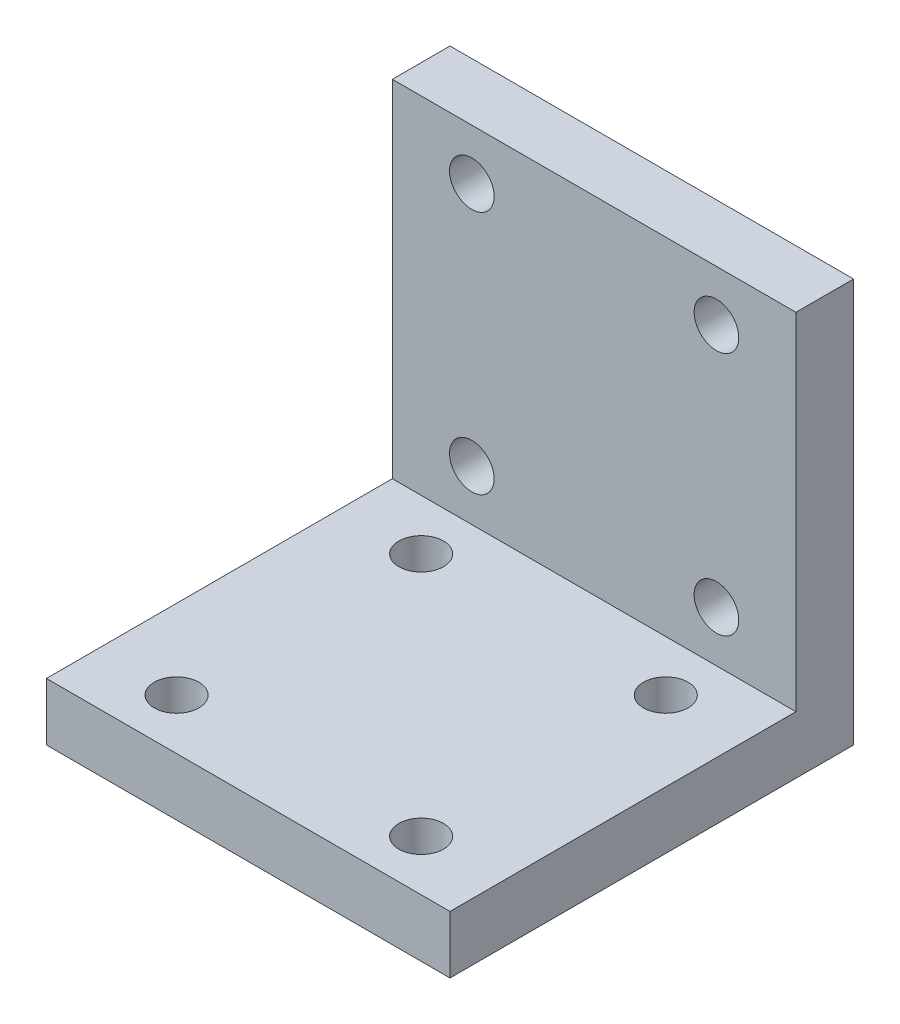
ISO-10303-21;
HEADER;
FILE_DESCRIPTION(('STEP AP214'),'2;1');
FILE_NAME('part.step','',(''),(''),'','','');
FILE_SCHEMA(('AUTOMOTIVE_DESIGN { 1 0 10303 214 1 1 1 1 }'));
ENDSEC;
DATA;
#1=APPLICATION_CONTEXT('core data for automotive mechanical design processes');
#2=APPLICATION_PROTOCOL_DEFINITION('international standard','automotive_design',2000,#1);
#3=PRODUCT_CONTEXT('',#1,'mechanical');
#4=PRODUCT('Part','Part','',(#3));
#5=PRODUCT_RELATED_PRODUCT_CATEGORY('part','',(#4));
#6=PRODUCT_DEFINITION_FORMATION('','',#4);
#7=PRODUCT_DEFINITION_CONTEXT('part definition',#1,'design');
#8=PRODUCT_DEFINITION('design','',#6,#7);
#9=PRODUCT_DEFINITION_SHAPE('','',#8);
#10=(LENGTH_UNIT() NAMED_UNIT(*) SI_UNIT(.MILLI.,.METRE.));
#11=(NAMED_UNIT(*) PLANE_ANGLE_UNIT() SI_UNIT($,.RADIAN.));
#12=(NAMED_UNIT(*) SI_UNIT($,.STERADIAN.) SOLID_ANGLE_UNIT());
#13=UNCERTAINTY_MEASURE_WITH_UNIT(LENGTH_MEASURE(1.E-05),#10,'distance_accuracy_value','');
#14=(GEOMETRIC_REPRESENTATION_CONTEXT(3) GLOBAL_UNCERTAINTY_ASSIGNED_CONTEXT((#13)) GLOBAL_UNIT_ASSIGNED_CONTEXT((#10,
#11,#12)) REPRESENTATION_CONTEXT('',''));
#15=CARTESIAN_POINT('',(0.,0.,0.));
#16=DIRECTION('',(0.,0.,1.));
#17=DIRECTION('',(1.,0.,0.));
#18=AXIS2_PLACEMENT_3D('',#15,#16,#17);
#19=CARTESIAN_POINT('',(-22.225,6.34999999999999,0.));
#20=DIRECTION('',(0.,0.,1.));
#21=DIRECTION('',(0.,-1.,0.));
#22=AXIS2_PLACEMENT_3D('',#19,#20,#21);
#23=PLANE('',#22);
#24=DIRECTION('',(0.,-1.,0.));
#25=VECTOR('',#24,1.);
#26=CARTESIAN_POINT('',(22.225,6.34999999999999,0.));
#27=LINE('',#26,#25);
#28=CARTESIAN_POINT('',(22.225,6.34999999999999,0.));
#29=VERTEX_POINT('',#28);
#30=CARTESIAN_POINT('',(22.225,0.,0.));
#31=VERTEX_POINT('',#30);
#32=EDGE_CURVE('E118',#29,#31,#27,.T.);
#33=ORIENTED_EDGE('',*,*,#32,.F.);
#34=DIRECTION('',(1.,0.,0.));
#35=VECTOR('',#34,1.);
#36=CARTESIAN_POINT('',(-22.225,6.34999999999999,0.));
#37=LINE('',#36,#35);
#38=CARTESIAN_POINT('',(-22.225,6.34999999999999,0.));
#39=VERTEX_POINT('',#38);
#40=EDGE_CURVE('E11',#39,#29,#37,.T.);
#41=ORIENTED_EDGE('',*,*,#40,.F.);
#42=DIRECTION('',(0.,-1.,0.));
#43=VECTOR('',#42,1.);
#44=CARTESIAN_POINT('',(-22.225,6.34999999999999,0.));
#45=LINE('',#44,#43);
#46=CARTESIAN_POINT('',(-22.225,0.,0.));
#47=VERTEX_POINT('',#46);
#48=EDGE_CURVE('E133',#39,#47,#45,.T.);
#49=ORIENTED_EDGE('',*,*,#48,.T.);
#50=DIRECTION('',(1.,0.,0.));
#51=VECTOR('',#50,1.);
#52=CARTESIAN_POINT('',(-22.225,0.,0.));
#53=LINE('',#52,#51);
#54=EDGE_CURVE('E36',#47,#31,#53,.T.);
#55=ORIENTED_EDGE('',*,*,#54,.T.);
#56=EDGE_LOOP('',(#33,#41,#49,#55));
#57=FACE_BOUND('',#56,.T.);
#58=ADVANCED_FACE('F33',(#57),#23,.T.);
#59=CARTESIAN_POINT('',(-22.225,6.34999999999999,-38.1));
#60=DIRECTION('',(0.,1.,0.));
#61=DIRECTION('',(0.,0.,1.));
#62=AXIS2_PLACEMENT_3D('',#59,#60,#61);
#63=PLANE('',#62);
#64=CARTESIAN_POINT('',(13.4703841816037,6.34999999999999,-5.57961581839627));
#65=DIRECTION('',(0.,1.,0.));
#66=DIRECTION('',(0.,0.,1.));
#67=AXIS2_PLACEMENT_3D('',#64,#65,#66);
#68=CIRCLE('',#67,2.45745);
#69=CARTESIAN_POINT('',(13.4703841816037,6.34999999999999,-3.12216581839628));
#70=VERTEX_POINT('',#69);
#71=EDGE_CURVE('E197',#70,#70,#68,.T.);
#72=ORIENTED_EDGE('',*,*,#71,.F.);
#73=EDGE_LOOP('',(#72));
#74=FACE_BOUND('',#73,.T.);
#75=CARTESIAN_POINT('',(-13.4703841816037,6.34999999999999,-32.5203841816037));
#76=DIRECTION('',(0.,1.,0.));
#77=DIRECTION('',(0.,0.,1.));
#78=AXIS2_PLACEMENT_3D('',#75,#76,#77);
#79=CIRCLE('',#78,2.45745);
#80=CARTESIAN_POINT('',(-13.4703841816037,6.34999999999999,-30.0629341816037));
#81=VERTEX_POINT('',#80);
#82=EDGE_CURVE('E193',#81,#81,#79,.T.);
#83=ORIENTED_EDGE('',*,*,#82,.F.);
#84=EDGE_LOOP('',(#83));
#85=FACE_BOUND('',#84,.T.);
#86=CARTESIAN_POINT('',(-13.4703841816037,6.34999999999999,-5.57961581839627));
#87=DIRECTION('',(0.,1.,0.));
#88=DIRECTION('',(0.,0.,1.));
#89=AXIS2_PLACEMENT_3D('',#86,#87,#88);
#90=CIRCLE('',#89,2.45745);
#91=CARTESIAN_POINT('',(-13.4703841816037,6.34999999999999,-3.12216581839627));
#92=VERTEX_POINT('',#91);
#93=EDGE_CURVE('E189',#92,#92,#90,.T.);
#94=ORIENTED_EDGE('',*,*,#93,.F.);
#95=EDGE_LOOP('',(#94));
#96=FACE_BOUND('',#95,.T.);
#97=CARTESIAN_POINT('',(13.4703841816037,6.34999999999999,-32.5203841816037));
#98=DIRECTION('',(0.,1.,0.));
#99=DIRECTION('',(0.,0.,1.));
#100=AXIS2_PLACEMENT_3D('',#97,#98,#99);
#101=CIRCLE('',#100,2.45745);
#102=CARTESIAN_POINT('',(13.4703841816037,6.34999999999999,-30.0629341816037));
#103=VERTEX_POINT('',#102);
#104=EDGE_CURVE('E181',#103,#103,#101,.T.);
#105=ORIENTED_EDGE('',*,*,#104,.F.);
#106=EDGE_LOOP('',(#105));
#107=FACE_BOUND('',#106,.T.);
#108=DIRECTION('',(0.,0.,1.));
#109=VECTOR('',#108,1.);
#110=CARTESIAN_POINT('',(22.225,6.34999999999999,-38.1));
#111=LINE('',#110,#109);
#112=CARTESIAN_POINT('',(22.225,6.34999999999999,-38.1));
#113=VERTEX_POINT('',#112);
#114=EDGE_CURVE('E131',#113,#29,#111,.T.);
#115=ORIENTED_EDGE('',*,*,#114,.F.);
#116=DIRECTION('',(1.,0.,0.));
#117=VECTOR('',#116,1.);
#118=CARTESIAN_POINT('',(-22.225,6.34999999999999,-38.1));
#119=LINE('',#118,#117);
#120=CARTESIAN_POINT('',(-22.225,6.34999999999999,-38.1));
#121=VERTEX_POINT('',#120);
#122=EDGE_CURVE('E42',#121,#113,#119,.T.);
#123=ORIENTED_EDGE('',*,*,#122,.F.);
#124=DIRECTION('',(0.,0.,1.));
#125=VECTOR('',#124,1.);
#126=CARTESIAN_POINT('',(-22.225,6.34999999999999,-38.1));
#127=LINE('',#126,#125);
#128=EDGE_CURVE('E108',#121,#39,#127,.T.);
#129=ORIENTED_EDGE('',*,*,#128,.T.);
#130=ORIENTED_EDGE('',*,*,#40,.T.);
#131=EDGE_LOOP('',(#115,#123,#129,#130));
#132=FACE_BOUND('',#131,.T.);
#133=ADVANCED_FACE('F141',(#74,#85,#96,#107,#132),#63,.T.);
#134=CARTESIAN_POINT('',(-22.225,44.45,-38.1));
#135=DIRECTION('',(0.,0.,1.));
#136=DIRECTION('',(1.,0.,0.));
#137=AXIS2_PLACEMENT_3D('',#134,#135,#136);
#138=PLANE('',#137);
#139=CARTESIAN_POINT('',(13.4703841816037,38.8703841816037,-38.1));
#140=DIRECTION('',(0.,0.,1.));
#141=DIRECTION('',(0.,-1.,0.));
#142=AXIS2_PLACEMENT_3D('',#139,#140,#141);
#143=CIRCLE('',#142,2.45745);
#144=CARTESIAN_POINT('',(13.4703841816037,36.4129341816037,-38.1));
#145=VERTEX_POINT('',#144);
#146=EDGE_CURVE('E221',#145,#145,#143,.T.);
#147=ORIENTED_EDGE('',*,*,#146,.F.);
#148=EDGE_LOOP('',(#147));
#149=FACE_BOUND('',#148,.T.);
#150=CARTESIAN_POINT('',(-13.4703841816037,11.9296158183963,-38.1));
#151=DIRECTION('',(0.,0.,1.));
#152=DIRECTION('',(0.,-1.,0.));
#153=AXIS2_PLACEMENT_3D('',#150,#151,#152);
#154=CIRCLE('',#153,2.45745);
#155=CARTESIAN_POINT('',(-13.4703841816037,9.47216581839625,-38.1));
#156=VERTEX_POINT('',#155);
#157=EDGE_CURVE('E215',#156,#156,#154,.T.);
#158=ORIENTED_EDGE('',*,*,#157,.F.);
#159=EDGE_LOOP('',(#158));
#160=FACE_BOUND('',#159,.T.);
#161=CARTESIAN_POINT('',(-13.4703841816037,38.8703841816037,-38.1));
#162=DIRECTION('',(0.,0.,1.));
#163=DIRECTION('',(0.,-1.,0.));
#164=AXIS2_PLACEMENT_3D('',#161,#162,#163);
#165=CIRCLE('',#164,2.45745);
#166=CARTESIAN_POINT('',(-13.4703841816037,36.4129341816037,-38.1));
#167=VERTEX_POINT('',#166);
#168=EDGE_CURVE('E209',#167,#167,#165,.T.);
#169=ORIENTED_EDGE('',*,*,#168,.F.);
#170=EDGE_LOOP('',(#169));
#171=FACE_BOUND('',#170,.T.);
#172=CARTESIAN_POINT('',(13.4703841816037,11.9296158183963,-38.1));
#173=DIRECTION('',(0.,0.,1.));
#174=DIRECTION('',(0.,-1.,0.));
#175=AXIS2_PLACEMENT_3D('',#172,#173,#174);
#176=CIRCLE('',#175,2.45745);
#177=CARTESIAN_POINT('',(13.4703841816037,9.47216581839625,-38.1));
#178=VERTEX_POINT('',#177);
#179=EDGE_CURVE('E203',#178,#178,#176,.T.);
#180=ORIENTED_EDGE('',*,*,#179,.F.);
#181=EDGE_LOOP('',(#180));
#182=FACE_BOUND('',#181,.T.);
#183=DIRECTION('',(0.,-1.,0.));
#184=VECTOR('',#183,1.);
#185=CARTESIAN_POINT('',(22.225,44.45,-38.1));
#186=LINE('',#185,#184);
#187=CARTESIAN_POINT('',(22.225,44.45,-38.1));
#188=VERTEX_POINT('',#187);
#189=EDGE_CURVE('E95',#188,#113,#186,.T.);
#190=ORIENTED_EDGE('',*,*,#189,.F.);
#191=DIRECTION('',(1.,0.,0.));
#192=VECTOR('',#191,1.);
#193=CARTESIAN_POINT('',(-22.225,44.45,-38.1));
#194=LINE('',#193,#192);
#195=CARTESIAN_POINT('',(-22.225,44.45,-38.1));
#196=VERTEX_POINT('',#195);
#197=EDGE_CURVE('E90',#196,#188,#194,.T.);
#198=ORIENTED_EDGE('',*,*,#197,.F.);
#199=DIRECTION('',(0.,-1.,0.));
#200=VECTOR('',#199,1.);
#201=CARTESIAN_POINT('',(-22.225,44.45,-38.1));
#202=LINE('',#201,#200);
#203=EDGE_CURVE('E93',#196,#121,#202,.T.);
#204=ORIENTED_EDGE('',*,*,#203,.T.);
#205=ORIENTED_EDGE('',*,*,#122,.T.);
#206=EDGE_LOOP('',(#190,#198,#204,#205));
#207=FACE_BOUND('',#206,.T.);
#208=ADVANCED_FACE('F92',(#149,#160,#171,#182,#207),#138,.T.);
#209=CARTESIAN_POINT('',(-22.225,44.45,-44.45));
#210=DIRECTION('',(0.,1.,0.));
#211=DIRECTION('',(0.,0.,1.));
#212=AXIS2_PLACEMENT_3D('',#209,#210,#211);
#213=PLANE('',#212);
#214=DIRECTION('',(0.,0.,1.));
#215=VECTOR('',#214,1.);
#216=CARTESIAN_POINT('',(22.225,44.45,-44.45));
#217=LINE('',#216,#215);
#218=CARTESIAN_POINT('',(22.225,44.45,-44.45));
#219=VERTEX_POINT('',#218);
#220=EDGE_CURVE('E128',#219,#188,#217,.T.);
#221=ORIENTED_EDGE('',*,*,#220,.F.);
#222=DIRECTION('',(1.,0.,0.));
#223=VECTOR('',#222,1.);
#224=CARTESIAN_POINT('',(-22.225,44.45,-44.45));
#225=LINE('',#224,#223);
#226=CARTESIAN_POINT('',(-22.225,44.45,-44.45));
#227=VERTEX_POINT('',#226);
#228=EDGE_CURVE('E100',#227,#219,#225,.T.);
#229=ORIENTED_EDGE('',*,*,#228,.F.);
#230=DIRECTION('',(0.,0.,1.));
#231=VECTOR('',#230,1.);
#232=CARTESIAN_POINT('',(-22.225,44.45,-44.45));
#233=LINE('',#232,#231);
#234=EDGE_CURVE('E106',#227,#196,#233,.T.);
#235=ORIENTED_EDGE('',*,*,#234,.T.);
#236=ORIENTED_EDGE('',*,*,#197,.T.);
#237=EDGE_LOOP('',(#221,#229,#235,#236));
#238=FACE_BOUND('',#237,.T.);
#239=ADVANCED_FACE('F110',(#238),#213,.T.);
#240=CARTESIAN_POINT('',(-22.225,0.,-44.45));
#241=DIRECTION('',(0.,0.,-1.));
#242=DIRECTION('',(-1.,0.,0.));
#243=AXIS2_PLACEMENT_3D('',#240,#241,#242);
#244=PLANE('',#243);
#245=CARTESIAN_POINT('',(13.4703841816037,38.8703841816037,-44.45));
#246=DIRECTION('',(0.,0.,-1.));
#247=DIRECTION('',(-1.,0.,0.));
#248=AXIS2_PLACEMENT_3D('',#245,#246,#247);
#249=CIRCLE('',#248,2.45745);
#250=CARTESIAN_POINT('',(11.0129341816037,38.8703841816037,-44.45));
#251=VERTEX_POINT('',#250);
#252=EDGE_CURVE('E218',#251,#251,#249,.T.);
#253=ORIENTED_EDGE('',*,*,#252,.F.);
#254=EDGE_LOOP('',(#253));
#255=FACE_BOUND('',#254,.T.);
#256=CARTESIAN_POINT('',(-13.4703841816037,11.9296158183963,-44.45));
#257=DIRECTION('',(0.,0.,-1.));
#258=DIRECTION('',(-1.,0.,0.));
#259=AXIS2_PLACEMENT_3D('',#256,#257,#258);
#260=CIRCLE('',#259,2.45745);
#261=CARTESIAN_POINT('',(-15.9278341816037,11.9296158183963,-44.45));
#262=VERTEX_POINT('',#261);
#263=EDGE_CURVE('E212',#262,#262,#260,.T.);
#264=ORIENTED_EDGE('',*,*,#263,.F.);
#265=EDGE_LOOP('',(#264));
#266=FACE_BOUND('',#265,.T.);
#267=CARTESIAN_POINT('',(-13.4703841816037,38.8703841816037,-44.45));
#268=DIRECTION('',(0.,0.,-1.));
#269=DIRECTION('',(-1.,0.,0.));
#270=AXIS2_PLACEMENT_3D('',#267,#268,#269);
#271=CIRCLE('',#270,2.45745);
#272=CARTESIAN_POINT('',(-15.9278341816037,38.8703841816037,-44.45));
#273=VERTEX_POINT('',#272);
#274=EDGE_CURVE('E206',#273,#273,#271,.T.);
#275=ORIENTED_EDGE('',*,*,#274,.F.);
#276=EDGE_LOOP('',(#275));
#277=FACE_BOUND('',#276,.T.);
#278=CARTESIAN_POINT('',(13.4703841816037,11.9296158183963,-44.45));
#279=DIRECTION('',(0.,0.,-1.));
#280=DIRECTION('',(-1.,0.,0.));
#281=AXIS2_PLACEMENT_3D('',#278,#279,#280);
#282=CIRCLE('',#281,2.45745);
#283=CARTESIAN_POINT('',(11.0129341816037,11.9296158183963,-44.45));
#284=VERTEX_POINT('',#283);
#285=EDGE_CURVE('E200',#284,#284,#282,.T.);
#286=ORIENTED_EDGE('',*,*,#285,.F.);
#287=EDGE_LOOP('',(#286));
#288=FACE_BOUND('',#287,.T.);
#289=DIRECTION('',(0.,1.,0.));
#290=VECTOR('',#289,1.);
#291=CARTESIAN_POINT('',(22.225,0.,-44.45));
#292=LINE('',#291,#290);
#293=CARTESIAN_POINT('',(22.225,0.,-44.45));
#294=VERTEX_POINT('',#293);
#295=EDGE_CURVE('E125',#294,#219,#292,.T.);
#296=ORIENTED_EDGE('',*,*,#295,.F.);
#297=DIRECTION('',(1.,0.,0.));
#298=VECTOR('',#297,1.);
#299=CARTESIAN_POINT('',(-22.225,0.,-44.45));
#300=LINE('',#299,#298);
#301=CARTESIAN_POINT('',(-22.225,0.,-44.45));
#302=VERTEX_POINT('',#301);
#303=EDGE_CURVE('E136',#302,#294,#300,.T.);
#304=ORIENTED_EDGE('',*,*,#303,.F.);
#305=DIRECTION('',(0.,1.,0.));
#306=VECTOR('',#305,1.);
#307=CARTESIAN_POINT('',(-22.225,0.,-44.45));
#308=LINE('',#307,#306);
#309=EDGE_CURVE('E111',#302,#227,#308,.T.);
#310=ORIENTED_EDGE('',*,*,#309,.T.);
#311=ORIENTED_EDGE('',*,*,#228,.T.);
#312=EDGE_LOOP('',(#296,#304,#310,#311));
#313=FACE_BOUND('',#312,.T.);
#314=ADVANCED_FACE('F158',(#255,#266,#277,#288,#313),#244,.T.);
#315=CARTESIAN_POINT('',(-22.225,0.,0.));
#316=DIRECTION('',(0.,-1.,0.));
#317=DIRECTION('',(0.,0.,-1.));
#318=AXIS2_PLACEMENT_3D('',#315,#316,#317);
#319=PLANE('',#318);
#320=CARTESIAN_POINT('',(13.4703841816037,0.,-5.57961581839627));
#321=DIRECTION('',(0.,-1.,0.));
#322=DIRECTION('',(0.,0.,-1.));
#323=AXIS2_PLACEMENT_3D('',#320,#321,#322);
#324=CIRCLE('',#323,2.45745);
#325=CARTESIAN_POINT('',(13.4703841816037,0.,-8.03706581839627));
#326=VERTEX_POINT('',#325);
#327=EDGE_CURVE('E169',#326,#326,#324,.T.);
#328=ORIENTED_EDGE('',*,*,#327,.F.);
#329=EDGE_LOOP('',(#328));
#330=FACE_BOUND('',#329,.T.);
#331=CARTESIAN_POINT('',(-13.4703841816037,0.,-32.5203841816037));
#332=DIRECTION('',(0.,-1.,0.));
#333=DIRECTION('',(0.,0.,-1.));
#334=AXIS2_PLACEMENT_3D('',#331,#332,#333);
#335=CIRCLE('',#334,2.45745);
#336=CARTESIAN_POINT('',(-13.4703841816037,0.,-34.9778341816037));
#337=VERTEX_POINT('',#336);
#338=EDGE_CURVE('E173',#337,#337,#335,.T.);
#339=ORIENTED_EDGE('',*,*,#338,.F.);
#340=EDGE_LOOP('',(#339));
#341=FACE_BOUND('',#340,.T.);
#342=CARTESIAN_POINT('',(-13.4703841816037,0.,-5.57961581839627));
#343=DIRECTION('',(0.,-1.,0.));
#344=DIRECTION('',(0.,0.,-1.));
#345=AXIS2_PLACEMENT_3D('',#342,#343,#344);
#346=CIRCLE('',#345,2.45745);
#347=CARTESIAN_POINT('',(-13.4703841816037,0.,-8.03706581839627));
#348=VERTEX_POINT('',#347);
#349=EDGE_CURVE('E177',#348,#348,#346,.T.);
#350=ORIENTED_EDGE('',*,*,#349,.F.);
#351=EDGE_LOOP('',(#350));
#352=FACE_BOUND('',#351,.T.);
#353=CARTESIAN_POINT('',(13.4703841816037,0.,-32.5203841816037));
#354=DIRECTION('',(0.,-1.,0.));
#355=DIRECTION('',(0.,0.,-1.));
#356=AXIS2_PLACEMENT_3D('',#353,#354,#355);
#357=CIRCLE('',#356,2.45745);
#358=CARTESIAN_POINT('',(13.4703841816037,0.,-34.9778341816037));
#359=VERTEX_POINT('',#358);
#360=EDGE_CURVE('E122',#359,#359,#357,.T.);
#361=ORIENTED_EDGE('',*,*,#360,.F.);
#362=EDGE_LOOP('',(#361));
#363=FACE_BOUND('',#362,.T.);
#364=DIRECTION('',(0.,0.,-1.));
#365=VECTOR('',#364,1.);
#366=CARTESIAN_POINT('',(22.225,0.,0.));
#367=LINE('',#366,#365);
#368=EDGE_CURVE('E121',#31,#294,#367,.T.);
#369=ORIENTED_EDGE('',*,*,#368,.F.);
#370=ORIENTED_EDGE('',*,*,#54,.F.);
#371=DIRECTION('',(0.,0.,-1.));
#372=VECTOR('',#371,1.);
#373=CARTESIAN_POINT('',(-22.225,0.,0.));
#374=LINE('',#373,#372);
#375=EDGE_CURVE('E113',#47,#302,#374,.T.);
#376=ORIENTED_EDGE('',*,*,#375,.T.);
#377=ORIENTED_EDGE('',*,*,#303,.T.);
#378=EDGE_LOOP('',(#369,#370,#376,#377));
#379=FACE_BOUND('',#378,.T.);
#380=ADVANCED_FACE('F138',(#330,#341,#352,#363,#379),#319,.T.);
#381=CARTESIAN_POINT('',(-22.225,0.,0.));
#382=DIRECTION('',(1.,0.,0.));
#383=DIRECTION('',(0.,0.,-1.));
#384=AXIS2_PLACEMENT_3D('',#381,#382,#383);
#385=PLANE('',#384);
#386=ORIENTED_EDGE('',*,*,#48,.F.);
#387=ORIENTED_EDGE('',*,*,#128,.F.);
#388=ORIENTED_EDGE('',*,*,#203,.F.);
#389=ORIENTED_EDGE('',*,*,#234,.F.);
#390=ORIENTED_EDGE('',*,*,#309,.F.);
#391=ORIENTED_EDGE('',*,*,#375,.F.);
#392=EDGE_LOOP('',(#386,#387,#388,#389,#390,#391));
#393=FACE_BOUND('',#392,.T.);
#394=ADVANCED_FACE('F104',(#393),#385,.F.);
#395=CARTESIAN_POINT('',(22.225,0.,0.));
#396=DIRECTION('',(1.,0.,0.));
#397=DIRECTION('',(0.,0.,-1.));
#398=AXIS2_PLACEMENT_3D('',#395,#396,#397);
#399=PLANE('',#398);
#400=ORIENTED_EDGE('',*,*,#32,.T.);
#401=ORIENTED_EDGE('',*,*,#368,.T.);
#402=ORIENTED_EDGE('',*,*,#295,.T.);
#403=ORIENTED_EDGE('',*,*,#220,.T.);
#404=ORIENTED_EDGE('',*,*,#189,.T.);
#405=ORIENTED_EDGE('',*,*,#114,.T.);
#406=EDGE_LOOP('',(#400,#401,#402,#403,#404,#405));
#407=FACE_BOUND('',#406,.T.);
#408=ADVANCED_FACE('F140',(#407),#399,.T.);
#409=CARTESIAN_POINT('',(13.4703841816037,6.34999999999999,-32.5203841816037));
#410=DIRECTION('',(0.,1.,0.));
#411=DIRECTION('',(0.,0.,1.));
#412=AXIS2_PLACEMENT_3D('',#409,#410,#411);
#413=CYLINDRICAL_SURFACE('',#412,2.45745);
#414=ORIENTED_EDGE('',*,*,#104,.T.);
#415=EDGE_LOOP('',(#414));
#416=FACE_BOUND('',#415,.T.);
#417=ORIENTED_EDGE('',*,*,#360,.T.);
#418=EDGE_LOOP('',(#417));
#419=FACE_BOUND('',#418,.T.);
#420=ADVANCED_FACE('F260',(#416,#419),#413,.F.);
#421=CARTESIAN_POINT('',(-13.4703841816037,6.34999999999999,-5.57961581839627));
#422=DIRECTION('',(0.,1.,0.));
#423=DIRECTION('',(0.,0.,1.));
#424=AXIS2_PLACEMENT_3D('',#421,#422,#423);
#425=CYLINDRICAL_SURFACE('',#424,2.45745);
#426=ORIENTED_EDGE('',*,*,#93,.T.);
#427=EDGE_LOOP('',(#426));
#428=FACE_BOUND('',#427,.T.);
#429=ORIENTED_EDGE('',*,*,#349,.T.);
#430=EDGE_LOOP('',(#429));
#431=FACE_BOUND('',#430,.T.);
#432=ADVANCED_FACE('F256',(#428,#431),#425,.F.);
#433=CARTESIAN_POINT('',(-13.4703841816037,6.34999999999999,-32.5203841816037));
#434=DIRECTION('',(0.,1.,0.));
#435=DIRECTION('',(0.,0.,1.));
#436=AXIS2_PLACEMENT_3D('',#433,#434,#435);
#437=CYLINDRICAL_SURFACE('',#436,2.45745);
#438=ORIENTED_EDGE('',*,*,#82,.T.);
#439=EDGE_LOOP('',(#438));
#440=FACE_BOUND('',#439,.T.);
#441=ORIENTED_EDGE('',*,*,#338,.T.);
#442=EDGE_LOOP('',(#441));
#443=FACE_BOUND('',#442,.T.);
#444=ADVANCED_FACE('F249',(#440,#443),#437,.F.);
#445=CARTESIAN_POINT('',(13.4703841816037,6.34999999999999,-5.57961581839627));
#446=DIRECTION('',(0.,1.,0.));
#447=DIRECTION('',(0.,0.,1.));
#448=AXIS2_PLACEMENT_3D('',#445,#446,#447);
#449=CYLINDRICAL_SURFACE('',#448,2.45745);
#450=ORIENTED_EDGE('',*,*,#71,.T.);
#451=EDGE_LOOP('',(#450));
#452=FACE_BOUND('',#451,.T.);
#453=ORIENTED_EDGE('',*,*,#327,.T.);
#454=EDGE_LOOP('',(#453));
#455=FACE_BOUND('',#454,.T.);
#456=ADVANCED_FACE('F238',(#452,#455),#449,.F.);
#457=CARTESIAN_POINT('',(13.4703841816037,11.9296158183963,-38.1));
#458=DIRECTION('',(0.,0.,1.));
#459=DIRECTION('',(0.,-1.,0.));
#460=AXIS2_PLACEMENT_3D('',#457,#458,#459);
#461=CYLINDRICAL_SURFACE('',#460,2.45745);
#462=ORIENTED_EDGE('',*,*,#179,.T.);
#463=EDGE_LOOP('',(#462));
#464=FACE_BOUND('',#463,.T.);
#465=ORIENTED_EDGE('',*,*,#285,.T.);
#466=EDGE_LOOP('',(#465));
#467=FACE_BOUND('',#466,.T.);
#468=ADVANCED_FACE('F234',(#464,#467),#461,.F.);
#469=CARTESIAN_POINT('',(-13.4703841816037,38.8703841816037,-38.1));
#470=DIRECTION('',(0.,0.,1.));
#471=DIRECTION('',(0.,-1.,0.));
#472=AXIS2_PLACEMENT_3D('',#469,#470,#471);
#473=CYLINDRICAL_SURFACE('',#472,2.45745);
#474=ORIENTED_EDGE('',*,*,#168,.T.);
#475=EDGE_LOOP('',(#474));
#476=FACE_BOUND('',#475,.T.);
#477=ORIENTED_EDGE('',*,*,#274,.T.);
#478=EDGE_LOOP('',(#477));
#479=FACE_BOUND('',#478,.T.);
#480=ADVANCED_FACE('F237',(#476,#479),#473,.F.);
#481=CARTESIAN_POINT('',(-13.4703841816037,11.9296158183963,-38.1));
#482=DIRECTION('',(0.,0.,1.));
#483=DIRECTION('',(0.,-1.,0.));
#484=AXIS2_PLACEMENT_3D('',#481,#482,#483);
#485=CYLINDRICAL_SURFACE('',#484,2.45745);
#486=ORIENTED_EDGE('',*,*,#157,.T.);
#487=EDGE_LOOP('',(#486));
#488=FACE_BOUND('',#487,.T.);
#489=ORIENTED_EDGE('',*,*,#263,.T.);
#490=EDGE_LOOP('',(#489));
#491=FACE_BOUND('',#490,.T.);
#492=ADVANCED_FACE('F246',(#488,#491),#485,.F.);
#493=CARTESIAN_POINT('',(13.4703841816037,38.8703841816037,-38.1));
#494=DIRECTION('',(0.,0.,1.));
#495=DIRECTION('',(0.,-1.,0.));
#496=AXIS2_PLACEMENT_3D('',#493,#494,#495);
#497=CYLINDRICAL_SURFACE('',#496,2.45745);
#498=ORIENTED_EDGE('',*,*,#146,.T.);
#499=EDGE_LOOP('',(#498));
#500=FACE_BOUND('',#499,.T.);
#501=ORIENTED_EDGE('',*,*,#252,.T.);
#502=EDGE_LOOP('',(#501));
#503=FACE_BOUND('',#502,.T.);
#504=ADVANCED_FACE('F225',(#500,#503),#497,.F.);
#505=CLOSED_SHELL('',(#58,#133,#208,#239,#314,#380,#394,#408,#420,#432,#444,#456,#468,#480,#492,#504));
#506=MANIFOLD_SOLID_BREP('B2',#505);
#507=ADVANCED_BREP_SHAPE_REPRESENTATION('',(#18,#506),#14);
#508=SHAPE_DEFINITION_REPRESENTATION(#9,#507);
ENDSEC;
END-ISO-10303-21;
